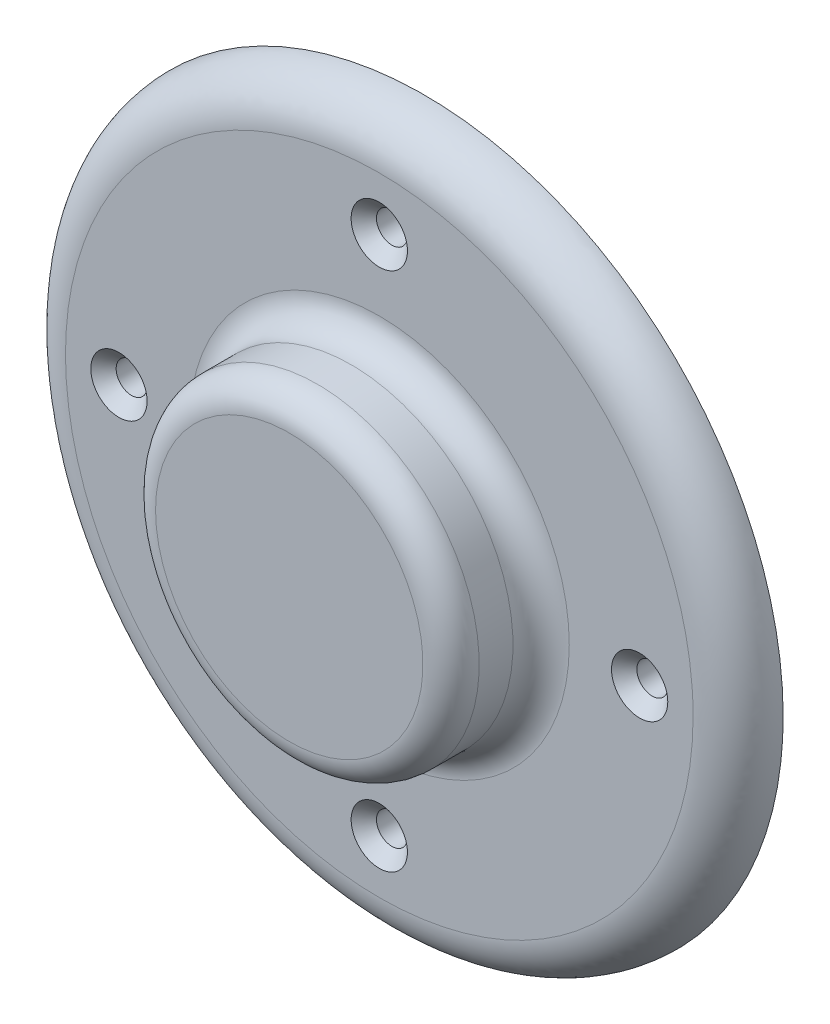
ISO-10303-21;
HEADER;
FILE_DESCRIPTION(('STEP AP214'),'2;1');
FILE_NAME('part.step','',(''),(''),'','','');
FILE_SCHEMA(('AUTOMOTIVE_DESIGN { 1 0 10303 214 1 1 1 1 }'));
ENDSEC;
DATA;
#1=APPLICATION_CONTEXT('core data for automotive mechanical design processes');
#2=APPLICATION_PROTOCOL_DEFINITION('international standard','automotive_design',2000,#1);
#3=PRODUCT_CONTEXT('',#1,'mechanical');
#4=PRODUCT('Part','Part','',(#3));
#5=PRODUCT_RELATED_PRODUCT_CATEGORY('part','',(#4));
#6=PRODUCT_DEFINITION_FORMATION('','',#4);
#7=PRODUCT_DEFINITION_CONTEXT('part definition',#1,'design');
#8=PRODUCT_DEFINITION('design','',#6,#7);
#9=PRODUCT_DEFINITION_SHAPE('','',#8);
#10=(LENGTH_UNIT() NAMED_UNIT(*) SI_UNIT(.MILLI.,.METRE.));
#11=(NAMED_UNIT(*) PLANE_ANGLE_UNIT() SI_UNIT($,.RADIAN.));
#12=(NAMED_UNIT(*) SI_UNIT($,.STERADIAN.) SOLID_ANGLE_UNIT());
#13=UNCERTAINTY_MEASURE_WITH_UNIT(LENGTH_MEASURE(1.E-05),#10,'distance_accuracy_value','');
#14=(GEOMETRIC_REPRESENTATION_CONTEXT(3) GLOBAL_UNCERTAINTY_ASSIGNED_CONTEXT((#13)) GLOBAL_UNIT_ASSIGNED_CONTEXT((#10,
#11,#12)) REPRESENTATION_CONTEXT('',''));
#15=CARTESIAN_POINT('',(0.,0.,0.));
#16=DIRECTION('',(0.,0.,1.));
#17=DIRECTION('',(1.,0.,0.));
#18=AXIS2_PLACEMENT_3D('',#15,#16,#17);
#19=CARTESIAN_POINT('',(111.5,0.,-32.));
#20=CARTESIAN_POINT('',(111.5,7.29765793494043,-32.));
#21=CARTESIAN_POINT('',(110.781261201404,14.5951354209112,-32.));
#22=CARTESIAN_POINT('',(107.933856328517,28.9100063886852,-32.));
#23=CARTESIAN_POINT('',(105.805260661656,35.9270459074172,-32.));
#24=CARTESIAN_POINT('',(100.219875088361,49.4113595099975,-32.));
#25=CARTESIAN_POINT('',(96.7632232910851,55.8783001678728,-32.));
#26=CARTESIAN_POINT('',(88.6545002523825,68.0138617954985,-32.));
#27=CARTESIAN_POINT('',(84.0026295147641,73.682182689778,-32.));
#28=CARTESIAN_POINT('',(73.6821826898364,84.0026295148216,-32.));
#29=CARTESIAN_POINT('',(68.0138617954407,88.6545002523824,-32.));
#30=CARTESIAN_POINT('',(55.8783001679308,96.7632232910851,-32.));
#31=CARTESIAN_POINT('',(49.4113595099399,100.219875088361,-32.));
#32=CARTESIAN_POINT('',(35.9270459074753,105.805260661656,-32.));
#33=CARTESIAN_POINT('',(28.9100063886999,107.933856328459,-32.));
#34=CARTESIAN_POINT('',(14.5951354208969,110.781261201461,-32.));
#35=CARTESIAN_POINT('',(7.29765793482629,111.5,-32.));
#36=CARTESIAN_POINT('',(-7.29765793482667,111.5,-32.));
#37=CARTESIAN_POINT('',(-14.5951354208967,110.781261201404,-32.));
#38=CARTESIAN_POINT('',(-28.9100063886997,107.933856328517,-32.));
#39=CARTESIAN_POINT('',(-35.9270459074461,105.805260661772,-32.));
#40=CARTESIAN_POINT('',(-49.4113595099686,100.219875088245,-32.));
#41=CARTESIAN_POINT('',(-55.8783001678148,96.7632232910851,-32.));
#42=CARTESIAN_POINT('',(-68.0138617955564,88.6545002523825,-32.));
#43=CARTESIAN_POINT('',(-73.6821826898912,84.0026295147668,-32.));
#44=CARTESIAN_POINT('',(-84.0026295147085,73.6821826898337,-32.));
#45=CARTESIAN_POINT('',(-88.6545002523845,68.0138617955237,-32.));
#46=CARTESIAN_POINT('',(-96.763223291083,55.8783001678477,-32.));
#47=CARTESIAN_POINT('',(-100.219875088318,49.4113595099743,-32.));
#48=CARTESIAN_POINT('',(-105.805260661698,35.927045907441,-32.));
#49=CARTESIAN_POINT('',(-107.933856328494,28.9100063886998,-32.));
#50=CARTESIAN_POINT('',(-110.781261201426,14.595135420897,-32.));
#51=CARTESIAN_POINT('',(-111.5,7.29765793482624,-32.));
#52=CARTESIAN_POINT('',(-111.5,-7.29765793482671,-32.));
#53=CARTESIAN_POINT('',(-110.781261201484,-14.5951354208968,-32.));
#54=CARTESIAN_POINT('',(-107.933856328436,-28.9100063886996,-32.));
#55=CARTESIAN_POINT('',(-105.805260661756,-35.9270459074118,-32.));
#56=CARTESIAN_POINT('',(-100.219875088261,-49.4113595100029,-32.));
#57=CARTESIAN_POINT('',(-96.7632232910831,-55.8783001679345,-32.));
#58=CARTESIAN_POINT('',(-88.6545002523845,-68.0138617954367,-32.));
#59=CARTESIAN_POINT('',(-84.0026295147665,-73.6821826897756,-32.));
#60=CARTESIAN_POINT('',(-73.6821826898334,-84.0026295148245,-32.));
#61=CARTESIAN_POINT('',(-68.0138617957843,-88.6545002521528,-32.));
#62=CARTESIAN_POINT('',(-55.8783001675872,-96.7632232913146,-32.));
#63=CARTESIAN_POINT('',(-49.4113595101598,-100.219875088224,-32.));
#64=CARTESIAN_POINT('',(-35.9270459072555,-105.805260661793,-32.));
#65=CARTESIAN_POINT('',(-28.9100063884827,-107.933856328534,-32.));
#66=CARTESIAN_POINT('',(-14.5951354211141,-110.781261201386,-32.));
#67=CARTESIAN_POINT('',(-7.29765793503299,-111.5,-32.));
#68=CARTESIAN_POINT('',(7.29765793503315,-111.5,-32.));
#69=CARTESIAN_POINT('',(14.5951354206941,-110.781261201444,-32.));
#70=CARTESIAN_POINT('',(28.9100063889023,-107.933856328477,-32.));
#71=CARTESIAN_POINT('',(35.9270459072844,-105.805260661793,-32.));
#72=CARTESIAN_POINT('',(49.4113595101307,-100.219875088224,-32.));
#73=CARTESIAN_POINT('',(55.8783001679914,-96.7632232910257,-32.));
#74=CARTESIAN_POINT('',(68.0138617953798,-88.6545002524419,-32.));
#75=CARTESIAN_POINT('',(73.6821826899066,-84.0026295146935,-32.));
#76=CARTESIAN_POINT('',(84.0026295146936,-73.6821826899065,-32.));
#77=CARTESIAN_POINT('',(88.6545002522682,-68.0138617957851,-32.));
#78=CARTESIAN_POINT('',(96.7632232911994,-55.8783001675861,-32.));
#79=CARTESIAN_POINT('',(100.219875088358,-49.4113595098497,-32.));
#80=CARTESIAN_POINT('',(105.805260661659,-35.9270459075653,-32.));
#81=CARTESIAN_POINT('',(107.933856328519,-28.9100063885586,-32.));
#82=CARTESIAN_POINT('',(110.781261201401,-14.5951354210381,-32.));
#83=CARTESIAN_POINT('',(111.5,-7.29765793494042,-32.));
#84=CARTESIAN_POINT('',(111.5,0.,-32.));
#85=CARTESIAN_POINT('',(127.5,0.,-32.));
#86=CARTESIAN_POINT('',(127.5,8.34485548614264,-32.));
#87=CARTESIAN_POINT('',(126.678123795358,16.6895046292848,-32.));
#88=CARTESIAN_POINT('',(123.422122707466,33.0585274848277,-32.));
#89=CARTESIAN_POINT('',(120.988078335141,41.0824964412424,-32.));
#90=CARTESIAN_POINT('',(114.601202455237,56.5017788118551,-32.));
#91=CARTESIAN_POINT('',(110.648528875434,63.8967109543173,-32.));
#92=CARTESIAN_POINT('',(101.376222261715,77.7736984656812,-32.));
#93=CARTESIAN_POINT('',(96.0568185034413,84.2554106990704,-32.));
#94=CARTESIAN_POINT('',(84.2554106991288,96.0568185034987,-32.));
#95=CARTESIAN_POINT('',(77.7736984656234,101.376222261715,-32.));
#96=CARTESIAN_POINT('',(63.8967109543753,110.648528875434,-32.));
#97=CARTESIAN_POINT('',(56.5017788118265,114.601202455237,-32.));
#98=CARTESIAN_POINT('',(41.0824964412717,120.988078335141,-32.));
#99=CARTESIAN_POINT('',(33.058527484828,123.422122707466,-32.));
#100=CARTESIAN_POINT('',(16.689504629285,126.678123795358,-32.));
#101=CARTESIAN_POINT('',(8.34485548601212,127.5,-32.));
#102=CARTESIAN_POINT('',(-8.34485548601256,127.5,-32.));
#103=CARTESIAN_POINT('',(-16.6895046292848,126.678123795358,-32.));
#104=CARTESIAN_POINT('',(-33.0585274848277,123.422122707466,-32.));
#105=CARTESIAN_POINT('',(-41.0824964412424,120.988078335199,-32.));
#106=CARTESIAN_POINT('',(-56.5017788118551,114.601202455179,-32.));
#107=CARTESIAN_POINT('',(-63.8967109542594,110.648528875434,-32.));
#108=CARTESIAN_POINT('',(-77.7736984657391,101.376222261715,-32.));
#109=CARTESIAN_POINT('',(-84.2554106991417,96.0568185034858,-32.));
#110=CARTESIAN_POINT('',(-96.0568185034275,84.2554106990842,-32.));
#111=CARTESIAN_POINT('',(-101.376222261684,77.7736984657267,-32.));
#112=CARTESIAN_POINT('',(-110.648528875465,63.896710954272,-32.));
#113=CARTESIAN_POINT('',(-114.601202455288,56.5017788118577,-32.));
#114=CARTESIAN_POINT('',(-120.98807833509,41.0824964412405,-32.));
#115=CARTESIAN_POINT('',(-123.422122707489,33.0585274848281,-32.));
#116=CARTESIAN_POINT('',(-126.678123795334,16.6895046292848,-32.));
#117=CARTESIAN_POINT('',(-127.5,8.34485548601207,-32.));
#118=CARTESIAN_POINT('',(-127.5,-8.34485548601261,-32.));
#119=CARTESIAN_POINT('',(-126.678123795334,-16.6895046292846,-32.));
#120=CARTESIAN_POINT('',(-123.422122707489,-33.0585274848279,-32.));
#121=CARTESIAN_POINT('',(-120.988078335206,-41.0824964412401,-32.));
#122=CARTESIAN_POINT('',(-114.601202455172,-56.5017788118574,-32.));
#123=CARTESIAN_POINT('',(-110.648528875465,-63.8967109543297,-32.));
#124=CARTESIAN_POINT('',(-101.376222261684,-77.7736984656687,-32.));
#125=CARTESIAN_POINT('',(-96.0568185034276,-84.255410699084,-32.));
#126=CARTESIAN_POINT('',(-84.2554106991418,-96.0568185034857,-32.));
#127=CARTESIAN_POINT('',(-77.7736984660163,-101.376222261453,-32.));
#128=CARTESIAN_POINT('',(-63.8967109539825,-110.648528875696,-32.));
#129=CARTESIAN_POINT('',(-56.5017788120448,-114.601202455146,-32.));
#130=CARTESIAN_POINT('',(-41.0824964410534,-120.988078335232,-32.));
#131=CARTESIAN_POINT('',(-33.0585274845965,-123.422122707535,-32.));
#132=CARTESIAN_POINT('',(-16.6895046295166,-126.678123795288,-32.));
#133=CARTESIAN_POINT('',(-8.34485548624849,-127.5,-32.));
#134=CARTESIAN_POINT('',(8.34485548624867,-127.5,-32.));
#135=CARTESIAN_POINT('',(16.6895046290531,-126.678123795404,-32.));
#136=CARTESIAN_POINT('',(33.0585274850594,-123.42212270742,-32.));
#137=CARTESIAN_POINT('',(41.0824964410533,-120.988078335232,-32.));
#138=CARTESIAN_POINT('',(56.5017788120447,-114.601202455146,-32.));
#139=CARTESIAN_POINT('',(63.896710954428,-110.648528875399,-32.));
#140=CARTESIAN_POINT('',(77.7736984655705,-101.37622226175,-32.));
#141=CARTESIAN_POINT('',(84.2554106992255,-96.0568185033441,-32.));
#142=CARTESIAN_POINT('',(96.0568185033442,-84.2554106992254,-32.));
#143=CARTESIAN_POINT('',(101.376222261518,-77.7736984660337,-32.));
#144=CARTESIAN_POINT('',(110.648528875631,-63.8967109539648,-32.));
#145=CARTESIAN_POINT('',(114.601202455275,-56.5017788117195,-32.));
#146=CARTESIAN_POINT('',(120.988078335103,-41.0824964413783,-32.));
#147=CARTESIAN_POINT('',(123.422122707518,-33.0585274846832,-32.));
#148=CARTESIAN_POINT('',(126.678123795306,-16.6895046294296,-32.));
#149=CARTESIAN_POINT('',(127.5,-8.34485548614263,-32.));
#150=CARTESIAN_POINT('',(127.5,0.,-32.));
#151=CARTESIAN_POINT('',(127.5,0.,-48.));
#152=CARTESIAN_POINT('',(127.5,8.34485548614264,-48.));
#153=CARTESIAN_POINT('',(126.678123795356,16.6895046292844,-48.));
#154=CARTESIAN_POINT('',(123.422122707468,33.0585274848282,-48.));
#155=CARTESIAN_POINT('',(120.988078335169,41.0824964412536,-48.));
#156=CARTESIAN_POINT('',(114.60120245521,56.5017788118439,-48.));
#157=CARTESIAN_POINT('',(110.64852887545,63.8967109543283,-48.));
#158=CARTESIAN_POINT('',(101.376222261699,77.7736984656702,-48.));
#159=CARTESIAN_POINT('',(96.0568185034702,84.2554106990994,-48.));
#160=CARTESIAN_POINT('',(84.2554106990999,96.0568185034698,-48.));
#161=CARTESIAN_POINT('',(77.7736984656302,101.376222261725,-48.));
#162=CARTESIAN_POINT('',(63.8967109543685,110.648528875423,-48.));
#163=CARTESIAN_POINT('',(56.5017788118195,114.60120245522,-48.));
#164=CARTESIAN_POINT('',(41.0824964412787,120.988078335158,-48.));
#165=CARTESIAN_POINT('',(33.0585274848284,123.422122707468,-48.));
#166=CARTESIAN_POINT('',(16.6895046292846,126.678123795356,-48.));
#167=CARTESIAN_POINT('',(8.34485548601212,127.5,-48.));
#168=CARTESIAN_POINT('',(-8.34485548601256,127.5,-48.));
#169=CARTESIAN_POINT('',(-16.6895046292843,126.678123795356,-48.));
#170=CARTESIAN_POINT('',(-33.0585274848282,123.422122707468,-48.));
#171=CARTESIAN_POINT('',(-41.0824964412331,120.988078335177,-48.));
#172=CARTESIAN_POINT('',(-56.5017788118644,114.601202455201,-48.));
#173=CARTESIAN_POINT('',(-63.8967109542883,110.648528875477,-48.));
#174=CARTESIAN_POINT('',(-77.7736984657102,101.376222261672,-48.));
#175=CARTESIAN_POINT('',(-84.2554106991127,96.0568185034568,-48.));
#176=CARTESIAN_POINT('',(-96.0568185034565,84.2554106991131,-48.));
#177=CARTESIAN_POINT('',(-101.376222261668,77.7736984657159,-48.));
#178=CARTESIAN_POINT('',(-110.648528875481,63.8967109542828,-48.));
#179=CARTESIAN_POINT('',(-114.601202455216,56.5017788118282,-48.));
#180=CARTESIAN_POINT('',(-120.988078335162,41.08249644127,-48.));
#181=CARTESIAN_POINT('',(-123.422122707469,33.058527484824,-48.));
#182=CARTESIAN_POINT('',(-126.678123795355,16.6895046292889,-48.));
#183=CARTESIAN_POINT('',(-127.5,8.34485548601207,-48.));
#184=CARTESIAN_POINT('',(-127.5,-8.34485548601261,-48.));
#185=CARTESIAN_POINT('',(-126.678123795355,-16.6895046292887,-48.));
#186=CARTESIAN_POINT('',(-123.422122707469,-33.0585274848238,-48.));
#187=CARTESIAN_POINT('',(-120.988078335179,-41.0824964412287,-48.));
#188=CARTESIAN_POINT('',(-114.601202455199,-56.5017788118688,-48.));
#189=CARTESIAN_POINT('',(-110.648528875454,-63.8967109543226,-48.));
#190=CARTESIAN_POINT('',(-101.376222261695,-77.7736984656757,-48.));
#191=CARTESIAN_POINT('',(-96.0568185034566,-84.255410699113,-48.));
#192=CARTESIAN_POINT('',(-84.2554106991129,-96.0568185034567,-48.));
#193=CARTESIAN_POINT('',(-77.7736984660231,-101.376222261463,-48.));
#194=CARTESIAN_POINT('',(-63.8967109539756,-110.648528875686,-48.));
#195=CARTESIAN_POINT('',(-56.5017788120378,-114.601202455129,-48.));
#196=CARTESIAN_POINT('',(-41.0824964410604,-120.988078335249,-48.));
#197=CARTESIAN_POINT('',(-33.0585274845924,-123.422122707515,-48.));
#198=CARTESIAN_POINT('',(-16.6895046295207,-126.678123795309,-48.));
#199=CARTESIAN_POINT('',(-8.34485548624849,-127.5,-48.));
#200=CARTESIAN_POINT('',(8.34485548624867,-127.5,-48.));
#201=CARTESIAN_POINT('',(16.6895046290526,-126.678123795402,-48.));
#202=CARTESIAN_POINT('',(33.0585274850599,-123.422122707422,-48.));
#203=CARTESIAN_POINT('',(41.0824964410603,-120.988078335249,-48.));
#204=CARTESIAN_POINT('',(56.5017788120377,-114.601202455129,-48.));
#205=CARTESIAN_POINT('',(63.8967109544209,-110.648528875388,-48.));
#206=CARTESIAN_POINT('',(77.7736984655776,-101.376222261761,-48.));
#207=CARTESIAN_POINT('',(84.2554106992255,-96.0568185033441,-48.));
#208=CARTESIAN_POINT('',(96.0568185033442,-84.2554106992254,-48.));
#209=CARTESIAN_POINT('',(101.376222261475,-77.7736984660049,-48.));
#210=CARTESIAN_POINT('',(110.648528875674,-63.8967109539937,-48.));
#211=CARTESIAN_POINT('',(114.601202455263,-56.5017788117146,-48.));
#212=CARTESIAN_POINT('',(120.988078335115,-41.0824964413832,-48.));
#213=CARTESIAN_POINT('',(123.422122707498,-33.0585274846791,-48.));
#214=CARTESIAN_POINT('',(126.678123795326,-16.6895046294337,-48.));
#215=CARTESIAN_POINT('',(127.5,-8.34485548614263,-48.));
#216=CARTESIAN_POINT('',(127.5,0.,-48.));
#217=(BOUNDED_SURFACE() B_SPLINE_SURFACE(2,3,((#19,#20,#21,#22,#23,#24,#25,#26,#27,#28,#29,#30,
#31,#32,#33,#34,#35,#36,#37,#38,#39,#40,#41,#42,#43,#44,#45,#46,#47,#48,#49,#50,#51,#52,#53,#54,
#55,#56,#57,#58,#59,#60,#61,#62,#63,#64,#65,#66,#67,#68,#69,#70,#71,#72,#73,#74,#75,#76,#77,#78,
#79,#80,#81,#82,#83,#84),(#85,#86,#87,#88,#89,#90,#91,#92,#93,#94,#95,#96,#97,#98,#99,#100,#101,
#102,#103,#104,#105,#106,#107,#108,#109,#110,#111,#112,#113,#114,#115,#116,#117,#118,#119,#120,
#121,#122,#123,#124,#125,#126,#127,#128,#129,#130,#131,#132,#133,#134,#135,#136,#137,#138,#139,
#140,#141,#142,#143,#144,#145,#146,#147,#148,#149,#150),(#151,#152,#153,#154,#155,#156,#157,
#158,#159,#160,#161,#162,#163,#164,#165,#166,#167,#168,#169,#170,#171,#172,#173,#174,#175,#176,
#177,#178,#179,#180,#181,#182,#183,#184,#185,#186,#187,#188,#189,#190,#191,#192,#193,#194,#195,
#196,#197,#198,#199,#200,#201,#202,#203,#204,#205,#206,#207,#208,#209,#210,#211,#212,#213,#214,
#215,#216)),.UNSPECIFIED.,.F.,.T.,.F.) B_SPLINE_SURFACE_WITH_KNOTS((3,3),(4,2,2,2,2,2,2,2,2,2,2,
2,2,2,2,2,2,2,2,2,2,2,2,2,2,2,2,2,2,2,2,2,4),(0.,1.),(-6.28318530717959,-6.08683576633022,
-5.89048622548086,-5.6941366846315,-5.49778714378214,-5.30143760293278,-5.10508806208341,
-4.90873852123405,-4.71238898038469,-4.51603943953533,-4.31968989868597,-4.1233403578366,
-3.92699081698724,-3.73064127613788,-3.53429173528852,-3.33794219443916,-3.14159265358979,
-2.94524311274043,-2.74889357189107,-2.55254403104171,-2.35619449019234,-2.15984494934298,
-1.96349540849362,-1.76714586764426,-1.5707963267949,-1.37444678594553,-1.17809724509617,
-0.98174770424681,-0.785398163397448,-0.589048622548086,-0.392699081698724,-0.196349540849362,
0.),.UNSPECIFIED.) GEOMETRIC_REPRESENTATION_ITEM() RATIONAL_B_SPLINE_SURFACE(((1.,1.,1.,1.,1.,
1.,1.,1.,1.,1.,1.,1.,1.,1.,1.,1.,1.,1.,1.,1.,1.,1.,1.,1.,1.,1.,1.,1.,1.,1.,1.,1.,1.,1.,1.,1.,1.,
1.,1.,1.,1.,1.,1.,1.,1.,1.,1.,1.,1.,1.,1.,1.,1.,1.,1.,1.,1.,1.,1.,1.,1.,1.,1.,1.,1.,1.),
(0.707106781186548,0.707106781186548,0.707106781186548,0.707106781186548,0.707106781186548,
0.707106781186548,0.707106781186548,0.707106781186548,0.707106781186548,0.707106781186548,
0.707106781186548,0.707106781186548,0.707106781186548,0.707106781186548,0.707106781186548,
0.707106781186548,0.707106781186548,0.707106781186548,0.707106781186548,0.707106781186548,
0.707106781186548,0.707106781186548,0.707106781186548,0.707106781186548,0.707106781186548,
0.707106781186548,0.707106781186548,0.707106781186548,0.707106781186548,0.707106781186548,
0.707106781186548,0.707106781186548,0.707106781186548,0.707106781186548,0.707106781186548,
0.707106781186548,0.707106781186548,0.707106781186548,0.707106781186548,0.707106781186548,
0.707106781186548,0.707106781186548,0.707106781186548,0.707106781186548,0.707106781186548,
0.707106781186548,0.707106781186548,0.707106781186548,0.707106781186548,0.707106781186548,
0.707106781186548,0.707106781186548,0.707106781186548,0.707106781186548,0.707106781186548,
0.707106781186548,0.707106781186548,0.707106781186548,0.707106781186548,0.707106781186548,
0.707106781186548,0.707106781186548,0.707106781186548,0.707106781186548,0.707106781186548,
0.707106781186548),(1.,1.,1.,1.,1.,1.,1.,1.,1.,1.,1.,1.,1.,1.,1.,1.,1.,1.,1.,1.,1.,1.,1.,1.,1.,
1.,1.,1.,1.,1.,1.,1.,1.,1.,1.,1.,1.,1.,1.,1.,1.,1.,1.,1.,1.,1.,1.,1.,1.,1.,1.,1.,1.,1.,1.,1.,1.,
1.,1.,1.,1.,1.,1.,1.,1.,1.))) REPRESENTATION_ITEM('') SURFACE());
#218=CARTESIAN_POINT('',(111.5,0.,-32.));
#219=CARTESIAN_POINT('',(111.5,-7.29765793494042,-32.));
#220=CARTESIAN_POINT('',(110.781261201401,-14.5951354210381,-32.));
#221=CARTESIAN_POINT('',(107.933856328519,-28.9100063885586,-32.));
#222=CARTESIAN_POINT('',(105.805260661659,-35.9270459075653,-32.));
#223=CARTESIAN_POINT('',(100.219875088358,-49.4113595098497,-32.));
#224=CARTESIAN_POINT('',(96.7632232911994,-55.8783001675861,-32.));
#225=CARTESIAN_POINT('',(88.6545002522682,-68.0138617957851,-32.));
#226=CARTESIAN_POINT('',(84.0026295146936,-73.6821826899065,-32.));
#227=CARTESIAN_POINT('',(73.6821826899066,-84.0026295146935,-32.));
#228=CARTESIAN_POINT('',(68.0138617953798,-88.6545002524419,-32.));
#229=CARTESIAN_POINT('',(55.8783001679914,-96.7632232910257,-32.));
#230=CARTESIAN_POINT('',(49.4113595101307,-100.219875088224,-32.));
#231=CARTESIAN_POINT('',(35.9270459072844,-105.805260661793,-32.));
#232=CARTESIAN_POINT('',(28.9100063889023,-107.933856328477,-32.));
#233=CARTESIAN_POINT('',(14.5951354206941,-110.781261201444,-32.));
#234=CARTESIAN_POINT('',(7.29765793503315,-111.5,-32.));
#235=CARTESIAN_POINT('',(-7.29765793503299,-111.5,-32.));
#236=CARTESIAN_POINT('',(-14.5951354211141,-110.781261201386,-32.));
#237=CARTESIAN_POINT('',(-28.9100063884827,-107.933856328534,-32.));
#238=CARTESIAN_POINT('',(-35.9270459072555,-105.805260661793,-32.));
#239=CARTESIAN_POINT('',(-49.4113595101598,-100.219875088224,-32.));
#240=CARTESIAN_POINT('',(-55.8783001675872,-96.7632232913146,-32.));
#241=CARTESIAN_POINT('',(-68.0138617957843,-88.6545002521528,-32.));
#242=CARTESIAN_POINT('',(-73.6821826898334,-84.0026295148245,-32.));
#243=CARTESIAN_POINT('',(-84.0026295147665,-73.6821826897756,-32.));
#244=CARTESIAN_POINT('',(-88.6545002523845,-68.0138617954367,-32.));
#245=CARTESIAN_POINT('',(-96.7632232910831,-55.8783001679345,-32.));
#246=CARTESIAN_POINT('',(-100.219875088261,-49.4113595100029,-32.));
#247=CARTESIAN_POINT('',(-105.805260661756,-35.9270459074118,-32.));
#248=CARTESIAN_POINT('',(-107.933856328436,-28.9100063886996,-32.));
#249=CARTESIAN_POINT('',(-110.781261201484,-14.5951354208968,-32.));
#250=CARTESIAN_POINT('',(-111.5,-7.29765793482671,-32.));
#251=CARTESIAN_POINT('',(-111.5,7.29765793482624,-32.));
#252=CARTESIAN_POINT('',(-110.781261201426,14.595135420897,-32.));
#253=CARTESIAN_POINT('',(-107.933856328494,28.9100063886998,-32.));
#254=CARTESIAN_POINT('',(-105.805260661698,35.927045907441,-32.));
#255=CARTESIAN_POINT('',(-100.219875088318,49.4113595099743,-32.));
#256=CARTESIAN_POINT('',(-96.763223291083,55.8783001678477,-32.));
#257=CARTESIAN_POINT('',(-88.6545002523845,68.0138617955237,-32.));
#258=CARTESIAN_POINT('',(-84.0026295147085,73.6821826898337,-32.));
#259=CARTESIAN_POINT('',(-73.6821826898912,84.0026295147668,-32.));
#260=CARTESIAN_POINT('',(-68.0138617955564,88.6545002523825,-32.));
#261=CARTESIAN_POINT('',(-55.8783001678148,96.7632232910851,-32.));
#262=CARTESIAN_POINT('',(-49.4113595099686,100.219875088245,-32.));
#263=CARTESIAN_POINT('',(-35.9270459074461,105.805260661772,-32.));
#264=CARTESIAN_POINT('',(-28.9100063886997,107.933856328517,-32.));
#265=CARTESIAN_POINT('',(-14.5951354208967,110.781261201404,-32.));
#266=CARTESIAN_POINT('',(-7.29765793482667,111.5,-32.));
#267=CARTESIAN_POINT('',(7.29765793482629,111.5,-32.));
#268=CARTESIAN_POINT('',(14.5951354208969,110.781261201461,-32.));
#269=CARTESIAN_POINT('',(28.9100063886999,107.933856328459,-32.));
#270=CARTESIAN_POINT('',(35.9270459074753,105.805260661656,-32.));
#271=CARTESIAN_POINT('',(49.4113595099399,100.219875088361,-32.));
#272=CARTESIAN_POINT('',(55.8783001679308,96.7632232910851,-32.));
#273=CARTESIAN_POINT('',(68.0138617954407,88.6545002523824,-32.));
#274=CARTESIAN_POINT('',(73.6821826898364,84.0026295148216,-32.));
#275=CARTESIAN_POINT('',(84.0026295147641,73.682182689778,-32.));
#276=CARTESIAN_POINT('',(88.6545002523825,68.0138617954985,-32.));
#277=CARTESIAN_POINT('',(96.7632232910851,55.8783001678728,-32.));
#278=CARTESIAN_POINT('',(100.219875088361,49.4113595099975,-32.));
#279=CARTESIAN_POINT('',(105.805260661656,35.9270459074172,-32.));
#280=CARTESIAN_POINT('',(107.933856328517,28.9100063886852,-32.));
#281=CARTESIAN_POINT('',(110.781261201404,14.5951354209112,-32.));
#282=CARTESIAN_POINT('',(111.5,7.29765793494043,-32.));
#283=CARTESIAN_POINT('',(111.5,0.,-32.));
#284=(BOUNDED_CURVE() B_SPLINE_CURVE(3,(#218,#219,#220,#221,#222,#223,#224,#225,#226,#227,#228,
#229,#230,#231,#232,#233,#234,#235,#236,#237,#238,#239,#240,#241,#242,#243,#244,#245,#246,#247,
#248,#249,#250,#251,#252,#253,#254,#255,#256,#257,#258,#259,#260,#261,#262,#263,#264,#265,#266,
#267,#268,#269,#270,#271,#272,#273,#274,#275,#276,#277,#278,#279,#280,#281,#282,#283),
.UNSPECIFIED.,.T.,.F.) B_SPLINE_CURVE_WITH_KNOTS((4,2,2,2,2,2,2,2,2,2,2,2,2,2,2,2,2,2,2,2,2,2,2,
2,2,2,2,2,2,2,2,2,4),(-6.28318530717959,-6.08683576633022,-5.89048622548086,-5.6941366846315,
-5.49778714378214,-5.30143760293278,-5.10508806208341,-4.90873852123405,-4.71238898038469,
-4.51603943953533,-4.31968989868597,-4.1233403578366,-3.92699081698724,-3.73064127613788,
-3.53429173528852,-3.33794219443916,-3.14159265358979,-2.94524311274043,-2.74889357189107,
-2.55254403104171,-2.35619449019234,-2.15984494934298,-1.96349540849362,-1.76714586764426,
-1.5707963267949,-1.37444678594553,-1.17809724509617,-0.981747704246811,-0.785398163397448,
-0.589048622548086,-0.392699081698725,-0.196349540849362,0.),
.UNSPECIFIED.) CURVE() GEOMETRIC_REPRESENTATION_ITEM() RATIONAL_B_SPLINE_CURVE((1.,1.,1.,1.,1.,
1.,1.,1.,1.,1.,1.,1.,1.,1.,1.,1.,1.,1.,1.,1.,1.,1.,1.,1.,1.,1.,1.,1.,1.,1.,1.,1.,1.,1.,1.,1.,1.,
1.,1.,1.,1.,1.,1.,1.,1.,1.,1.,1.,1.,1.,1.,1.,1.,1.,1.,1.,1.,1.,1.,1.,1.,1.,1.,1.,1.,1.)) REPRESENTATION_ITEM(''));
#285=CARTESIAN_POINT('',(111.5,0.,-32.));
#286=VERTEX_POINT('',#285);
#287=EDGE_CURVE('E10',#286,#286,#284,.F.);
#288=CARTESIAN_POINT('',(127.5,0.,-48.));
#289=CARTESIAN_POINT('',(127.5,8.34485548614264,-48.));
#290=CARTESIAN_POINT('',(126.678123795356,16.6895046292844,-48.));
#291=CARTESIAN_POINT('',(123.422122707468,33.0585274848282,-48.));
#292=CARTESIAN_POINT('',(120.988078335169,41.0824964412536,-48.));
#293=CARTESIAN_POINT('',(114.60120245521,56.5017788118439,-48.));
#294=CARTESIAN_POINT('',(110.64852887545,63.8967109543283,-48.));
#295=CARTESIAN_POINT('',(101.376222261699,77.7736984656702,-48.));
#296=CARTESIAN_POINT('',(96.0568185034702,84.2554106990994,-48.));
#297=CARTESIAN_POINT('',(84.2554106990999,96.0568185034698,-48.));
#298=CARTESIAN_POINT('',(77.7736984656302,101.376222261725,-48.));
#299=CARTESIAN_POINT('',(63.8967109543685,110.648528875423,-48.));
#300=CARTESIAN_POINT('',(56.5017788118195,114.60120245522,-48.));
#301=CARTESIAN_POINT('',(41.0824964412787,120.988078335158,-48.));
#302=CARTESIAN_POINT('',(33.0585274848284,123.422122707468,-48.));
#303=CARTESIAN_POINT('',(16.6895046292846,126.678123795356,-48.));
#304=CARTESIAN_POINT('',(8.34485548601212,127.5,-48.));
#305=CARTESIAN_POINT('',(-8.34485548601256,127.5,-48.));
#306=CARTESIAN_POINT('',(-16.6895046292843,126.678123795356,-48.));
#307=CARTESIAN_POINT('',(-33.0585274848282,123.422122707468,-48.));
#308=CARTESIAN_POINT('',(-41.0824964412331,120.988078335177,-48.));
#309=CARTESIAN_POINT('',(-56.5017788118644,114.601202455201,-48.));
#310=CARTESIAN_POINT('',(-63.8967109542883,110.648528875477,-48.));
#311=CARTESIAN_POINT('',(-77.7736984657102,101.376222261672,-48.));
#312=CARTESIAN_POINT('',(-84.2554106991127,96.0568185034568,-48.));
#313=CARTESIAN_POINT('',(-96.0568185034565,84.2554106991131,-48.));
#314=CARTESIAN_POINT('',(-101.376222261668,77.7736984657159,-48.));
#315=CARTESIAN_POINT('',(-110.648528875481,63.8967109542828,-48.));
#316=CARTESIAN_POINT('',(-114.601202455216,56.5017788118282,-48.));
#317=CARTESIAN_POINT('',(-120.988078335162,41.08249644127,-48.));
#318=CARTESIAN_POINT('',(-123.422122707469,33.058527484824,-48.));
#319=CARTESIAN_POINT('',(-126.678123795355,16.6895046292889,-48.));
#320=CARTESIAN_POINT('',(-127.5,8.34485548601207,-48.));
#321=CARTESIAN_POINT('',(-127.5,-8.34485548601261,-48.));
#322=CARTESIAN_POINT('',(-126.678123795355,-16.6895046292887,-48.));
#323=CARTESIAN_POINT('',(-123.422122707469,-33.0585274848238,-48.));
#324=CARTESIAN_POINT('',(-120.988078335179,-41.0824964412287,-48.));
#325=CARTESIAN_POINT('',(-114.601202455199,-56.5017788118688,-48.));
#326=CARTESIAN_POINT('',(-110.648528875454,-63.8967109543226,-48.));
#327=CARTESIAN_POINT('',(-101.376222261695,-77.7736984656757,-48.));
#328=CARTESIAN_POINT('',(-96.0568185034566,-84.255410699113,-48.));
#329=CARTESIAN_POINT('',(-84.2554106991129,-96.0568185034567,-48.));
#330=CARTESIAN_POINT('',(-77.7736984660231,-101.376222261463,-48.));
#331=CARTESIAN_POINT('',(-63.8967109539756,-110.648528875686,-48.));
#332=CARTESIAN_POINT('',(-56.5017788120378,-114.601202455129,-48.));
#333=CARTESIAN_POINT('',(-41.0824964410604,-120.988078335249,-48.));
#334=CARTESIAN_POINT('',(-33.0585274845924,-123.422122707515,-48.));
#335=CARTESIAN_POINT('',(-16.6895046295207,-126.678123795309,-48.));
#336=CARTESIAN_POINT('',(-8.34485548624849,-127.5,-48.));
#337=CARTESIAN_POINT('',(8.34485548624867,-127.5,-48.));
#338=CARTESIAN_POINT('',(16.6895046290526,-126.678123795402,-48.));
#339=CARTESIAN_POINT('',(33.0585274850599,-123.422122707422,-48.));
#340=CARTESIAN_POINT('',(41.0824964410603,-120.988078335249,-48.));
#341=CARTESIAN_POINT('',(56.5017788120377,-114.601202455129,-48.));
#342=CARTESIAN_POINT('',(63.8967109544209,-110.648528875388,-48.));
#343=CARTESIAN_POINT('',(77.7736984655776,-101.376222261761,-48.));
#344=CARTESIAN_POINT('',(84.2554106992255,-96.0568185033441,-48.));
#345=CARTESIAN_POINT('',(96.0568185033442,-84.2554106992254,-48.));
#346=CARTESIAN_POINT('',(101.376222261475,-77.7736984660049,-48.));
#347=CARTESIAN_POINT('',(110.648528875674,-63.8967109539937,-48.));
#348=CARTESIAN_POINT('',(114.601202455263,-56.5017788117146,-48.));
#349=CARTESIAN_POINT('',(120.988078335115,-41.0824964413832,-48.));
#350=CARTESIAN_POINT('',(123.422122707498,-33.0585274846791,-48.));
#351=CARTESIAN_POINT('',(126.678123795326,-16.6895046294337,-48.));
#352=CARTESIAN_POINT('',(127.5,-8.34485548614263,-48.));
#353=CARTESIAN_POINT('',(127.5,0.,-48.));
#354=(BOUNDED_CURVE() B_SPLINE_CURVE(3,(#288,#289,#290,#291,#292,#293,#294,#295,#296,#297,#298,
#299,#300,#301,#302,#303,#304,#305,#306,#307,#308,#309,#310,#311,#312,#313,#314,#315,#316,#317,
#318,#319,#320,#321,#322,#323,#324,#325,#326,#327,#328,#329,#330,#331,#332,#333,#334,#335,#336,
#337,#338,#339,#340,#341,#342,#343,#344,#345,#346,#347,#348,#349,#350,#351,#352,#353),
.UNSPECIFIED.,.T.,.F.) B_SPLINE_CURVE_WITH_KNOTS((4,2,2,2,2,2,2,2,2,2,2,2,2,2,2,2,2,2,2,2,2,2,2,
2,2,2,2,2,2,2,2,2,4),(-6.28318530717959,-6.08683576633022,-5.89048622548086,-5.6941366846315,
-5.49778714378214,-5.30143760293278,-5.10508806208341,-4.90873852123405,-4.71238898038469,
-4.51603943953533,-4.31968989868597,-4.1233403578366,-3.92699081698724,-3.73064127613788,
-3.53429173528852,-3.33794219443916,-3.14159265358979,-2.94524311274043,-2.74889357189107,
-2.55254403104171,-2.35619449019234,-2.15984494934298,-1.96349540849362,-1.76714586764426,
-1.5707963267949,-1.37444678594553,-1.17809724509617,-0.98174770424681,-0.785398163397448,
-0.589048622548086,-0.392699081698724,-0.196349540849362,0.),
.UNSPECIFIED.) CURVE() GEOMETRIC_REPRESENTATION_ITEM() RATIONAL_B_SPLINE_CURVE((1.,1.,1.,1.,1.,
1.,1.,1.,1.,1.,1.,1.,1.,1.,1.,1.,1.,1.,1.,1.,1.,1.,1.,1.,1.,1.,1.,1.,1.,1.,1.,1.,1.,1.,1.,1.,1.,
1.,1.,1.,1.,1.,1.,1.,1.,1.,1.,1.,1.,1.,1.,1.,1.,1.,1.,1.,1.,1.,1.,1.,1.,1.,1.,1.,1.,1.)) REPRESENTATION_ITEM(''));
#355=CARTESIAN_POINT('',(127.5,0.,-48.));
#356=VERTEX_POINT('',#355);
#357=EDGE_CURVE('E102',#356,#356,#354,.T.);
#358=ORIENTED_EDGE('',*,*,#287,.F.);
#359=EDGE_LOOP('',(#358));
#360=FACE_BOUND('',#359,.T.);
#361=ORIENTED_EDGE('',*,*,#357,.T.);
#362=EDGE_LOOP('',(#361));
#363=FACE_BOUND('',#362,.T.);
#364=ADVANCED_FACE('F30',(#360,#363),#217,.T.);
#365=CARTESIAN_POINT('',(0.,0.,0.));
#366=DIRECTION('',(0.,0.,-1.));
#367=DIRECTION('',(-1.,0.,0.));
#368=AXIS2_PLACEMENT_3D('',#365,#366,#367);
#369=PLANE('',#368);
#370=CARTESIAN_POINT('',(0.,0.,0.));
#371=DIRECTION('',(0.,0.,-1.));
#372=DIRECTION('',(-1.,0.,0.));
#373=AXIS2_PLACEMENT_3D('',#370,#371,#372);
#374=CIRCLE('',#373,47.5);
#375=CARTESIAN_POINT('',(-47.5,0.,0.));
#376=VERTEX_POINT('',#375);
#377=EDGE_CURVE('E42',#376,#376,#374,.F.);
#378=ORIENTED_EDGE('',*,*,#377,.T.);
#379=EDGE_LOOP('',(#378));
#380=FACE_BOUND('',#379,.T.);
#381=ADVANCED_FACE('F76',(#380),#369,.F.);
#382=CARTESIAN_POINT('',(0.,0.,0.));
#383=DIRECTION('',(0.,0.,1.));
#384=DIRECTION('',(1.,0.,0.));
#385=AXIS2_PLACEMENT_3D('',#382,#383,#384);
#386=CYLINDRICAL_SURFACE('',#385,57.5);
#387=CARTESIAN_POINT('',(0.,0.,-22.));
#388=DIRECTION('',(0.,0.,-1.));
#389=DIRECTION('',(-1.,0.,0.));
#390=AXIS2_PLACEMENT_3D('',#387,#388,#389);
#391=CIRCLE('',#390,57.5);
#392=CARTESIAN_POINT('',(-57.5,0.,-22.));
#393=VERTEX_POINT('',#392);
#394=EDGE_CURVE('E52',#393,#393,#391,.F.);
#395=ORIENTED_EDGE('',*,*,#394,.T.);
#396=EDGE_LOOP('',(#395));
#397=FACE_BOUND('',#396,.T.);
#398=CARTESIAN_POINT('',(0.,0.,-10.));
#399=DIRECTION('',(0.,0.,-1.));
#400=DIRECTION('',(-1.,0.,0.));
#401=AXIS2_PLACEMENT_3D('',#398,#399,#400);
#402=CIRCLE('',#401,57.5);
#403=CARTESIAN_POINT('',(-57.5,0.,-10.));
#404=VERTEX_POINT('',#403);
#405=EDGE_CURVE('E156',#404,#404,#402,.T.);
#406=ORIENTED_EDGE('',*,*,#405,.T.);
#407=EDGE_LOOP('',(#406));
#408=FACE_BOUND('',#407,.T.);
#409=ADVANCED_FACE('F71',(#397,#408),#386,.T.);
#410=CARTESIAN_POINT('',(-127.5,0.,-32.));
#411=DIRECTION('',(0.,0.,-1.));
#412=DIRECTION('',(-1.,0.,0.));
#413=AXIS2_PLACEMENT_3D('',#410,#411,#412);
#414=PLANE('',#413);
#415=ORIENTED_EDGE('',*,*,#287,.T.);
#416=EDGE_LOOP('',(#415));
#417=FACE_BOUND('',#416,.T.);
#418=CARTESIAN_POINT('',(0.,0.,-32.));
#419=DIRECTION('',(0.,0.,-1.));
#420=DIRECTION('',(-1.,0.,0.));
#421=AXIS2_PLACEMENT_3D('',#418,#419,#420);
#422=CIRCLE('',#421,67.5);
#423=CARTESIAN_POINT('',(-67.5,0.,-32.));
#424=VERTEX_POINT('',#423);
#425=EDGE_CURVE('E47',#424,#424,#422,.T.);
#426=ORIENTED_EDGE('',*,*,#425,.T.);
#427=EDGE_LOOP('',(#426));
#428=FACE_BOUND('',#427,.T.);
#429=CARTESIAN_POINT('',(9.68886071528969E-13,92.5,-32.));
#430=DIRECTION('',(0.,0.,1.));
#431=DIRECTION('',(1.,0.,0.));
#432=AXIS2_PLACEMENT_3D('',#429,#430,#431);
#433=CIRCLE('',#432,10.);
#434=CARTESIAN_POINT('',(10.000000000001,92.5,-32.));
#435=VERTEX_POINT('',#434);
#436=EDGE_CURVE('E152',#435,#435,#433,.T.);
#437=ORIENTED_EDGE('',*,*,#436,.F.);
#438=EDGE_LOOP('',(#437));
#439=FACE_BOUND('',#438,.T.);
#440=CARTESIAN_POINT('',(-92.5,6.4592404768598E-13,-32.));
#441=DIRECTION('',(0.,0.,1.));
#442=DIRECTION('',(1.,0.,0.));
#443=AXIS2_PLACEMENT_3D('',#440,#441,#442);
#444=CIRCLE('',#443,9.99999999999999);
#445=CARTESIAN_POINT('',(-82.5,6.4592404768598E-13,-32.));
#446=VERTEX_POINT('',#445);
#447=EDGE_CURVE('E148',#446,#446,#444,.T.);
#448=ORIENTED_EDGE('',*,*,#447,.F.);
#449=EDGE_LOOP('',(#448));
#450=FACE_BOUND('',#449,.T.);
#451=CARTESIAN_POINT('',(-3.2296202384299E-13,-92.5,-32.));
#452=DIRECTION('',(0.,0.,1.));
#453=DIRECTION('',(1.,0.,0.));
#454=AXIS2_PLACEMENT_3D('',#451,#452,#453);
#455=CIRCLE('',#454,10.);
#456=CARTESIAN_POINT('',(9.99999999999968,-92.5,-32.));
#457=VERTEX_POINT('',#456);
#458=EDGE_CURVE('E143',#457,#457,#455,.T.);
#459=ORIENTED_EDGE('',*,*,#458,.F.);
#460=EDGE_LOOP('',(#459));
#461=FACE_BOUND('',#460,.T.);
#462=CARTESIAN_POINT('',(92.5,0.,-32.));
#463=DIRECTION('',(0.,0.,1.));
#464=DIRECTION('',(1.,0.,0.));
#465=AXIS2_PLACEMENT_3D('',#462,#463,#464);
#466=CIRCLE('',#465,9.99999999999999);
#467=CARTESIAN_POINT('',(102.5,0.,-32.));
#468=VERTEX_POINT('',#467);
#469=EDGE_CURVE('E138',#468,#468,#466,.T.);
#470=ORIENTED_EDGE('',*,*,#469,.F.);
#471=EDGE_LOOP('',(#470));
#472=FACE_BOUND('',#471,.T.);
#473=ADVANCED_FACE('F61',(#417,#428,#439,#450,#461,#472),#414,.F.);
#474=CARTESIAN_POINT('',(-47.5,0.,-48.));
#475=DIRECTION('',(0.,0.,1.));
#476=DIRECTION('',(1.,0.,0.));
#477=AXIS2_PLACEMENT_3D('',#474,#475,#476);
#478=PLANE('',#477);
#479=CARTESIAN_POINT('',(9.68886071528969E-13,92.5,-48.));
#480=DIRECTION('',(0.,0.,1.));
#481=DIRECTION('',(1.,0.,0.));
#482=AXIS2_PLACEMENT_3D('',#479,#480,#481);
#483=CIRCLE('',#482,5.49999999999999);
#484=CARTESIAN_POINT('',(5.50000000000096,92.5,-48.));
#485=VERTEX_POINT('',#484);
#486=EDGE_CURVE('E149',#485,#485,#483,.T.);
#487=ORIENTED_EDGE('',*,*,#486,.T.);
#488=EDGE_LOOP('',(#487));
#489=FACE_BOUND('',#488,.T.);
#490=CARTESIAN_POINT('',(-92.5,6.4592404768598E-13,-48.));
#491=DIRECTION('',(0.,0.,1.));
#492=DIRECTION('',(1.,0.,0.));
#493=AXIS2_PLACEMENT_3D('',#490,#491,#492);
#494=CIRCLE('',#493,5.49999999999999);
#495=CARTESIAN_POINT('',(-87.,6.4592404768598E-13,-48.));
#496=VERTEX_POINT('',#495);
#497=EDGE_CURVE('E144',#496,#496,#494,.T.);
#498=ORIENTED_EDGE('',*,*,#497,.T.);
#499=EDGE_LOOP('',(#498));
#500=FACE_BOUND('',#499,.T.);
#501=CARTESIAN_POINT('',(-3.2296202384299E-13,-92.5,-48.));
#502=DIRECTION('',(0.,0.,1.));
#503=DIRECTION('',(1.,0.,0.));
#504=AXIS2_PLACEMENT_3D('',#501,#502,#503);
#505=CIRCLE('',#504,5.49999999999999);
#506=CARTESIAN_POINT('',(5.49999999999967,-92.5,-48.));
#507=VERTEX_POINT('',#506);
#508=EDGE_CURVE('E139',#507,#507,#505,.T.);
#509=ORIENTED_EDGE('',*,*,#508,.T.);
#510=EDGE_LOOP('',(#509));
#511=FACE_BOUND('',#510,.T.);
#512=CARTESIAN_POINT('',(92.5,0.,-48.));
#513=DIRECTION('',(0.,0.,1.));
#514=DIRECTION('',(1.,0.,0.));
#515=AXIS2_PLACEMENT_3D('',#512,#513,#514);
#516=CIRCLE('',#515,5.49999999999999);
#517=CARTESIAN_POINT('',(98.,0.,-48.));
#518=VERTEX_POINT('',#517);
#519=EDGE_CURVE('E135',#518,#518,#516,.T.);
#520=ORIENTED_EDGE('',*,*,#519,.T.);
#521=EDGE_LOOP('',(#520));
#522=FACE_BOUND('',#521,.T.);
#523=ORIENTED_EDGE('',*,*,#357,.F.);
#524=EDGE_LOOP('',(#523));
#525=FACE_BOUND('',#524,.T.);
#526=CARTESIAN_POINT('',(0.,0.,-48.));
#527=DIRECTION('',(0.,0.,1.));
#528=DIRECTION('',(1.,0.,0.));
#529=AXIS2_PLACEMENT_3D('',#526,#527,#528);
#530=CIRCLE('',#529,47.5);
#531=CARTESIAN_POINT('',(47.5,0.,-48.));
#532=VERTEX_POINT('',#531);
#533=EDGE_CURVE('E106',#532,#532,#530,.T.);
#534=ORIENTED_EDGE('',*,*,#533,.T.);
#535=EDGE_LOOP('',(#534));
#536=FACE_BOUND('',#535,.T.);
#537=ADVANCED_FACE('F70',(#489,#500,#511,#522,#525,#536),#478,.F.);
#538=CARTESIAN_POINT('',(0.,0.,0.));
#539=DIRECTION('',(0.,0.,1.));
#540=DIRECTION('',(1.,0.,0.));
#541=AXIS2_PLACEMENT_3D('',#538,#539,#540);
#542=CYLINDRICAL_SURFACE('',#541,47.5);
#543=ORIENTED_EDGE('',*,*,#533,.F.);
#544=EDGE_LOOP('',(#543));
#545=FACE_BOUND('',#544,.T.);
#546=CARTESIAN_POINT('',(0.,0.,-65.));
#547=DIRECTION('',(0.,0.,1.));
#548=DIRECTION('',(1.,0.,0.));
#549=AXIS2_PLACEMENT_3D('',#546,#547,#548);
#550=CIRCLE('',#549,47.5);
#551=CARTESIAN_POINT('',(47.5,0.,-65.));
#552=VERTEX_POINT('',#551);
#553=EDGE_CURVE('E126',#552,#552,#550,.T.);
#554=ORIENTED_EDGE('',*,*,#553,.T.);
#555=EDGE_LOOP('',(#554));
#556=FACE_BOUND('',#555,.T.);
#557=ADVANCED_FACE('F231',(#545,#556),#542,.T.);
#558=CARTESIAN_POINT('',(-47.5,0.,-65.));
#559=DIRECTION('',(0.,0.,1.));
#560=DIRECTION('',(1.,0.,0.));
#561=AXIS2_PLACEMENT_3D('',#558,#559,#560);
#562=PLANE('',#561);
#563=ORIENTED_EDGE('',*,*,#553,.F.);
#564=EDGE_LOOP('',(#563));
#565=FACE_BOUND('',#564,.T.);
#566=CARTESIAN_POINT('',(0.,0.,-65.));
#567=DIRECTION('',(0.,0.,1.));
#568=DIRECTION('',(1.,0.,0.));
#569=AXIS2_PLACEMENT_3D('',#566,#567,#568);
#570=CIRCLE('',#569,37.5);
#571=CARTESIAN_POINT('',(37.5,0.,-65.));
#572=VERTEX_POINT('',#571);
#573=EDGE_CURVE('E131',#572,#572,#570,.T.);
#574=ORIENTED_EDGE('',*,*,#573,.T.);
#575=EDGE_LOOP('',(#574));
#576=FACE_BOUND('',#575,.T.);
#577=ADVANCED_FACE('F171',(#565,#576),#562,.F.);
#578=CARTESIAN_POINT('',(0.,0.,0.));
#579=DIRECTION('',(0.,0.,1.));
#580=DIRECTION('',(1.,0.,0.));
#581=AXIS2_PLACEMENT_3D('',#578,#579,#580);
#582=CYLINDRICAL_SURFACE('',#581,37.5);
#583=CARTESIAN_POINT('',(0.,0.,-19.));
#584=DIRECTION('',(0.,0.,1.));
#585=DIRECTION('',(1.,0.,0.));
#586=AXIS2_PLACEMENT_3D('',#583,#584,#585);
#587=CIRCLE('',#586,37.5);
#588=CARTESIAN_POINT('',(37.5,0.,-19.));
#589=VERTEX_POINT('',#588);
#590=EDGE_CURVE('E105',#589,#589,#587,.T.);
#591=ORIENTED_EDGE('',*,*,#590,.T.);
#592=EDGE_LOOP('',(#591));
#593=FACE_BOUND('',#592,.T.);
#594=ORIENTED_EDGE('',*,*,#573,.F.);
#595=EDGE_LOOP('',(#594));
#596=FACE_BOUND('',#595,.T.);
#597=ADVANCED_FACE('F168',(#593,#596),#582,.F.);
#598=CARTESIAN_POINT('',(0.,0.,-8.99999999999999));
#599=DIRECTION('',(0.,0.,1.));
#600=DIRECTION('',(1.,0.,0.));
#601=AXIS2_PLACEMENT_3D('',#598,#599,#600);
#602=PLANE('',#601);
#603=CARTESIAN_POINT('',(0.,0.,-8.99999999999999));
#604=DIRECTION('',(0.,0.,1.));
#605=DIRECTION('',(1.,0.,0.));
#606=AXIS2_PLACEMENT_3D('',#603,#604,#605);
#607=CIRCLE('',#606,27.5);
#608=CARTESIAN_POINT('',(27.5,0.,-8.99999999999999));
#609=VERTEX_POINT('',#608);
#610=EDGE_CURVE('E123',#609,#609,#607,.F.);
#611=ORIENTED_EDGE('',*,*,#610,.T.);
#612=EDGE_LOOP('',(#611));
#613=FACE_BOUND('',#612,.T.);
#614=ADVANCED_FACE('F164',(#613),#602,.F.);
#615=CARTESIAN_POINT('',(92.5,0.,-32.));
#616=DIRECTION('',(0.,0.,1.));
#617=DIRECTION('',(1.,0.,0.));
#618=AXIS2_PLACEMENT_3D('',#615,#616,#617);
#619=CYLINDRICAL_SURFACE('',#618,5.49999999999999);
#620=CARTESIAN_POINT('',(92.5,0.,-36.5));
#621=DIRECTION('',(0.,0.,1.));
#622=DIRECTION('',(1.,0.,0.));
#623=AXIS2_PLACEMENT_3D('',#620,#621,#622);
#624=CIRCLE('',#623,5.49999999999999);
#625=CARTESIAN_POINT('',(98.,0.,-36.5));
#626=VERTEX_POINT('',#625);
#627=EDGE_CURVE('E142',#626,#626,#624,.T.);
#628=ORIENTED_EDGE('',*,*,#627,.T.);
#629=EDGE_LOOP('',(#628));
#630=FACE_BOUND('',#629,.T.);
#631=ORIENTED_EDGE('',*,*,#519,.F.);
#632=EDGE_LOOP('',(#631));
#633=FACE_BOUND('',#632,.T.);
#634=ADVANCED_FACE('F213',(#630,#633),#619,.F.);
#635=CARTESIAN_POINT('',(92.5,0.,-32.));
#636=DIRECTION('',(0.,0.,1.));
#637=DIRECTION('',(1.,0.,0.));
#638=AXIS2_PLACEMENT_3D('',#635,#636,#637);
#639=CONICAL_SURFACE('',#638,9.99999999999999,0.785398163397448);
#640=ORIENTED_EDGE('',*,*,#627,.F.);
#641=EDGE_LOOP('',(#640));
#642=FACE_BOUND('',#641,.T.);
#643=ORIENTED_EDGE('',*,*,#469,.T.);
#644=EDGE_LOOP('',(#643));
#645=FACE_BOUND('',#644,.T.);
#646=ADVANCED_FACE('F210',(#642,#645),#639,.F.);
#647=CARTESIAN_POINT('',(-3.2296202384299E-13,-92.5,-32.));
#648=DIRECTION('',(0.,0.,1.));
#649=DIRECTION('',(1.,0.,0.));
#650=AXIS2_PLACEMENT_3D('',#647,#648,#649);
#651=CYLINDRICAL_SURFACE('',#650,5.49999999999999);
#652=CARTESIAN_POINT('',(-3.2296202384299E-13,-92.5,-36.5));
#653=DIRECTION('',(0.,0.,1.));
#654=DIRECTION('',(1.,0.,0.));
#655=AXIS2_PLACEMENT_3D('',#652,#653,#654);
#656=CIRCLE('',#655,5.5);
#657=CARTESIAN_POINT('',(5.49999999999967,-92.5,-36.5));
#658=VERTEX_POINT('',#657);
#659=EDGE_CURVE('E147',#658,#658,#656,.T.);
#660=ORIENTED_EDGE('',*,*,#659,.T.);
#661=EDGE_LOOP('',(#660));
#662=FACE_BOUND('',#661,.T.);
#663=ORIENTED_EDGE('',*,*,#508,.F.);
#664=EDGE_LOOP('',(#663));
#665=FACE_BOUND('',#664,.T.);
#666=ADVANCED_FACE('F212',(#662,#665),#651,.F.);
#667=CARTESIAN_POINT('',(-3.2296202384299E-13,-92.5,-32.));
#668=DIRECTION('',(0.,0.,1.));
#669=DIRECTION('',(1.,0.,0.));
#670=AXIS2_PLACEMENT_3D('',#667,#668,#669);
#671=CONICAL_SURFACE('',#670,10.,0.785398163397448);
#672=ORIENTED_EDGE('',*,*,#659,.F.);
#673=EDGE_LOOP('',(#672));
#674=FACE_BOUND('',#673,.T.);
#675=ORIENTED_EDGE('',*,*,#458,.T.);
#676=EDGE_LOOP('',(#675));
#677=FACE_BOUND('',#676,.T.);
#678=ADVANCED_FACE('F220',(#674,#677),#671,.F.);
#679=CARTESIAN_POINT('',(-92.5,6.4592404768598E-13,-32.));
#680=DIRECTION('',(0.,0.,1.));
#681=DIRECTION('',(1.,0.,0.));
#682=AXIS2_PLACEMENT_3D('',#679,#680,#681);
#683=CYLINDRICAL_SURFACE('',#682,5.49999999999999);
#684=CARTESIAN_POINT('',(-92.5,6.4592404768598E-13,-36.5));
#685=DIRECTION('',(0.,0.,1.));
#686=DIRECTION('',(1.,0.,0.));
#687=AXIS2_PLACEMENT_3D('',#684,#685,#686);
#688=CIRCLE('',#687,5.49999999999999);
#689=CARTESIAN_POINT('',(-87.,6.4592404768598E-13,-36.5));
#690=VERTEX_POINT('',#689);
#691=EDGE_CURVE('E151',#690,#690,#688,.T.);
#692=ORIENTED_EDGE('',*,*,#691,.T.);
#693=EDGE_LOOP('',(#692));
#694=FACE_BOUND('',#693,.T.);
#695=ORIENTED_EDGE('',*,*,#497,.F.);
#696=EDGE_LOOP('',(#695));
#697=FACE_BOUND('',#696,.T.);
#698=ADVANCED_FACE('F253',(#694,#697),#683,.F.);
#699=CARTESIAN_POINT('',(-92.5,6.4592404768598E-13,-32.));
#700=DIRECTION('',(0.,0.,1.));
#701=DIRECTION('',(1.,0.,0.));
#702=AXIS2_PLACEMENT_3D('',#699,#700,#701);
#703=CONICAL_SURFACE('',#702,9.99999999999999,0.785398163397448);
#704=ORIENTED_EDGE('',*,*,#691,.F.);
#705=EDGE_LOOP('',(#704));
#706=FACE_BOUND('',#705,.T.);
#707=ORIENTED_EDGE('',*,*,#447,.T.);
#708=EDGE_LOOP('',(#707));
#709=FACE_BOUND('',#708,.T.);
#710=ADVANCED_FACE('F255',(#706,#709),#703,.F.);
#711=CARTESIAN_POINT('',(9.68886071528969E-13,92.5,-32.));
#712=DIRECTION('',(0.,0.,1.));
#713=DIRECTION('',(1.,0.,0.));
#714=AXIS2_PLACEMENT_3D('',#711,#712,#713);
#715=CYLINDRICAL_SURFACE('',#714,5.49999999999999);
#716=CARTESIAN_POINT('',(9.68886071528969E-13,92.5,-36.5));
#717=DIRECTION('',(0.,0.,1.));
#718=DIRECTION('',(1.,0.,0.));
#719=AXIS2_PLACEMENT_3D('',#716,#717,#718);
#720=CIRCLE('',#719,5.5);
#721=CARTESIAN_POINT('',(5.50000000000096,92.5,-36.5));
#722=VERTEX_POINT('',#721);
#723=EDGE_CURVE('E191',#722,#722,#720,.T.);
#724=ORIENTED_EDGE('',*,*,#723,.T.);
#725=EDGE_LOOP('',(#724));
#726=FACE_BOUND('',#725,.T.);
#727=ORIENTED_EDGE('',*,*,#486,.F.);
#728=EDGE_LOOP('',(#727));
#729=FACE_BOUND('',#728,.T.);
#730=ADVANCED_FACE('F195',(#726,#729),#715,.F.);
#731=CARTESIAN_POINT('',(9.68886071528969E-13,92.5,-32.));
#732=DIRECTION('',(0.,0.,1.));
#733=DIRECTION('',(1.,0.,0.));
#734=AXIS2_PLACEMENT_3D('',#731,#732,#733);
#735=CONICAL_SURFACE('',#734,10.,0.785398163397448);
#736=ORIENTED_EDGE('',*,*,#723,.F.);
#737=EDGE_LOOP('',(#736));
#738=FACE_BOUND('',#737,.T.);
#739=ORIENTED_EDGE('',*,*,#436,.T.);
#740=EDGE_LOOP('',(#739));
#741=FACE_BOUND('',#740,.T.);
#742=ADVANCED_FACE('F84',(#738,#741),#735,.F.);
#743=CARTESIAN_POINT('',(0.,0.,-19.));
#744=DIRECTION('',(0.,0.,1.));
#745=DIRECTION('',(1.,0.,0.));
#746=AXIS2_PLACEMENT_3D('',#743,#744,#745);
#747=TOROIDAL_SURFACE('',#746,27.5,10.);
#748=ORIENTED_EDGE('',*,*,#610,.F.);
#749=EDGE_LOOP('',(#748));
#750=FACE_BOUND('',#749,.T.);
#751=ORIENTED_EDGE('',*,*,#590,.F.);
#752=EDGE_LOOP('',(#751));
#753=FACE_BOUND('',#752,.T.);
#754=ADVANCED_FACE('F80',(#750,#753),#747,.F.);
#755=CARTESIAN_POINT('',(0.,0.,-22.));
#756=DIRECTION('',(0.,0.,-1.));
#757=DIRECTION('',(-1.,0.,0.));
#758=AXIS2_PLACEMENT_3D('',#755,#756,#757);
#759=TOROIDAL_SURFACE('',#758,67.5,10.);
#760=ORIENTED_EDGE('',*,*,#425,.F.);
#761=EDGE_LOOP('',(#760));
#762=FACE_BOUND('',#761,.T.);
#763=ORIENTED_EDGE('',*,*,#394,.F.);
#764=EDGE_LOOP('',(#763));
#765=FACE_BOUND('',#764,.T.);
#766=ADVANCED_FACE('F83',(#762,#765),#759,.F.);
#767=CARTESIAN_POINT('',(0.,0.,-10.));
#768=DIRECTION('',(0.,0.,-1.));
#769=DIRECTION('',(-1.,0.,0.));
#770=AXIS2_PLACEMENT_3D('',#767,#768,#769);
#771=TOROIDAL_SURFACE('',#770,47.5,10.);
#772=ORIENTED_EDGE('',*,*,#405,.F.);
#773=EDGE_LOOP('',(#772));
#774=FACE_BOUND('',#773,.T.);
#775=ORIENTED_EDGE('',*,*,#377,.F.);
#776=EDGE_LOOP('',(#775));
#777=FACE_BOUND('',#776,.T.);
#778=ADVANCED_FACE('F87',(#774,#777),#771,.T.);
#779=CLOSED_SHELL('',(#364,#381,#409,#473,#537,#557,#577,#597,#614,#634,#646,#666,#678,#698,
#710,#730,#742,#754,#766,#778));
#780=MANIFOLD_SOLID_BREP('B2',#779);
#781=ADVANCED_BREP_SHAPE_REPRESENTATION('',(#18,#780),#14);
#782=SHAPE_DEFINITION_REPRESENTATION(#9,#781);
ENDSEC;
END-ISO-10303-21;
